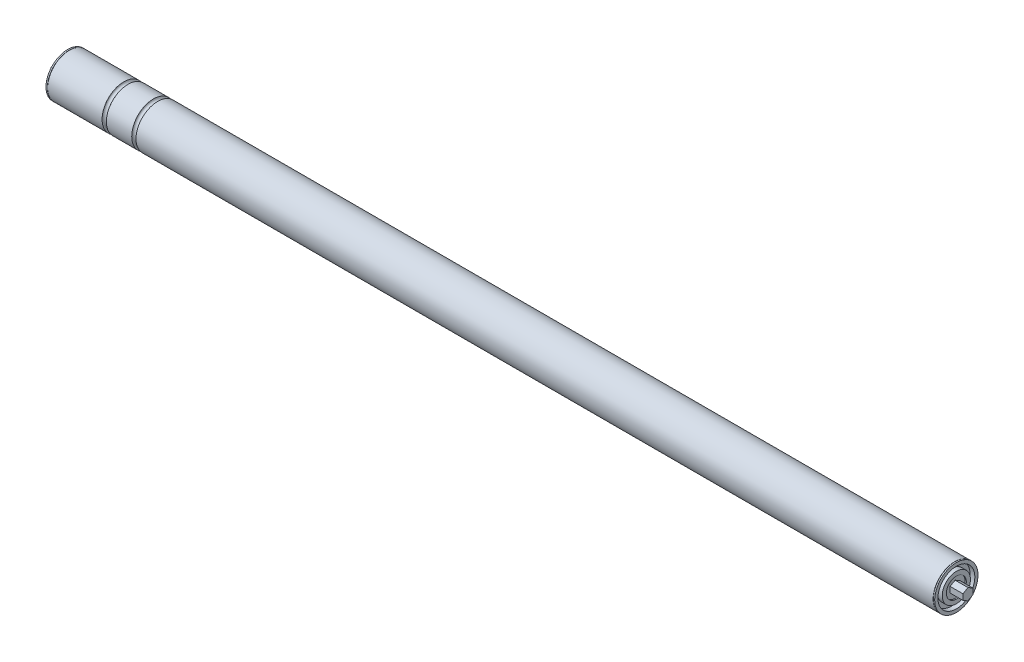
ISO-10303-21;
HEADER;
FILE_DESCRIPTION(('STEP AP214'),'2;1');
FILE_NAME('part.step','',(''),(''),'','','');
FILE_SCHEMA(('AUTOMOTIVE_DESIGN { 1 0 10303 214 1 1 1 1 }'));
ENDSEC;
DATA;
#1=APPLICATION_CONTEXT('core data for automotive mechanical design processes');
#2=APPLICATION_PROTOCOL_DEFINITION('international standard','automotive_design',2000,#1);
#3=PRODUCT_CONTEXT('',#1,'mechanical');
#4=PRODUCT('Part','Part','',(#3));
#5=PRODUCT_RELATED_PRODUCT_CATEGORY('part','',(#4));
#6=PRODUCT_DEFINITION_FORMATION('','',#4);
#7=PRODUCT_DEFINITION_CONTEXT('part definition',#1,'design');
#8=PRODUCT_DEFINITION('design','',#6,#7);
#9=PRODUCT_DEFINITION_SHAPE('','',#8);
#10=(LENGTH_UNIT() NAMED_UNIT(*) SI_UNIT(.MILLI.,.METRE.));
#11=(NAMED_UNIT(*) PLANE_ANGLE_UNIT() SI_UNIT($,.RADIAN.));
#12=(NAMED_UNIT(*) SI_UNIT($,.STERADIAN.) SOLID_ANGLE_UNIT());
#13=UNCERTAINTY_MEASURE_WITH_UNIT(LENGTH_MEASURE(1.E-05),#10,'distance_accuracy_value','');
#14=(GEOMETRIC_REPRESENTATION_CONTEXT(3) GLOBAL_UNCERTAINTY_ASSIGNED_CONTEXT((#13)) GLOBAL_UNIT_ASSIGNED_CONTEXT((#10,
#11,#12)) REPRESENTATION_CONTEXT('',''));
#15=CARTESIAN_POINT('',(0.,0.,0.));
#16=DIRECTION('',(0.,0.,1.));
#17=DIRECTION('',(1.,0.,0.));
#18=AXIS2_PLACEMENT_3D('',#15,#16,#17);
#19=CARTESIAN_POINT('',(556.234821520125,0.,0.));
#20=DIRECTION('',(-1.,0.,0.));
#21=DIRECTION('',(0.,0.,1.));
#22=AXIS2_PLACEMENT_3D('',#19,#20,#21);
#23=CYLINDRICAL_SURFACE('',#22,24.13);
#24=CARTESIAN_POINT('',(-427.830678291306,1.37139780605819E-13,0.));
#25=DIRECTION('',(1.,0.,0.));
#26=DIRECTION('',(0.,1.,0.));
#27=AXIS2_PLACEMENT_3D('',#24,#25,#26);
#28=CIRCLE('',#27,24.13);
#29=CARTESIAN_POINT('',(-427.830678291306,24.1300000000001,0.));
#30=VERTEX_POINT('',#29);
#31=EDGE_CURVE('E156',#30,#30,#28,.F.);
#32=ORIENTED_EDGE('',*,*,#31,.F.);
#33=EDGE_LOOP('',(#32));
#34=FACE_BOUND('',#33,.T.);
#35=CARTESIAN_POINT('',(-399.574321708694,1.26538187742656E-13,0.));
#36=DIRECTION('',(-1.,0.,0.));
#37=DIRECTION('',(0.,-1.,0.));
#38=AXIS2_PLACEMENT_3D('',#35,#36,#37);
#39=CIRCLE('',#38,24.13);
#40=CARTESIAN_POINT('',(-399.574321708693,-24.1299999999999,0.));
#41=VERTEX_POINT('',#40);
#42=EDGE_CURVE('E343',#41,#41,#39,.F.);
#43=ORIENTED_EDGE('',*,*,#42,.F.);
#44=EDGE_LOOP('',(#43));
#45=FACE_BOUND('',#44,.T.);
#46=ADVANCED_FACE('F39',(#34,#45),#23,.T.);
#47=CARTESIAN_POINT('',(-427.04385,1.38777878078145E-13,0.));
#48=DIRECTION('',(-1.,0.,0.));
#49=DIRECTION('',(0.,-1.,0.));
#50=AXIS2_PLACEMENT_3D('',#47,#48,#49);
#51=TOROIDAL_SURFACE('',#50,24.1000000000019,0.787399999999969);
#52=CARTESIAN_POINT('',(-427.83125,1.37158145291755E-13,0.));
#53=DIRECTION('',(-1.,0.,0.));
#54=DIRECTION('',(0.,-1.,0.));
#55=AXIS2_PLACEMENT_3D('',#52,#53,#54);
#56=CIRCLE('',#55,24.1000000000019);
#57=CARTESIAN_POINT('',(-427.83125,-24.1000000000017,0.));
#58=VERTEX_POINT('',#57);
#59=EDGE_CURVE('E163',#58,#58,#56,.T.);
#60=ORIENTED_EDGE('',*,*,#59,.F.);
#61=EDGE_LOOP('',(#60));
#62=FACE_BOUND('',#61,.T.);
#63=ORIENTED_EDGE('',*,*,#31,.T.);
#64=EDGE_LOOP('',(#63));
#65=FACE_BOUND('',#64,.T.);
#66=ADVANCED_FACE('F372',(#62,#65),#51,.T.);
#67=CARTESIAN_POINT('',(-433.38115,1.2490009027033E-13,0.));
#68=DIRECTION('',(-1.,0.,0.));
#69=DIRECTION('',(0.,-1.,0.));
#70=AXIS2_PLACEMENT_3D('',#67,#68,#69);
#71=TOROIDAL_SURFACE('',#70,24.1000000000019,0.787399999999969);
#72=CARTESIAN_POINT('',(-432.59375,1.27243098644159E-13,0.));
#73=DIRECTION('',(-1.,0.,0.));
#74=DIRECTION('',(0.,-1.,0.));
#75=AXIS2_PLACEMENT_3D('',#72,#73,#74);
#76=CIRCLE('',#75,24.1000000000019);
#77=CARTESIAN_POINT('',(-432.59375,-24.1000000000017,0.));
#78=VERTEX_POINT('',#77);
#79=EDGE_CURVE('E352',#78,#78,#76,.T.);
#80=ORIENTED_EDGE('',*,*,#79,.T.);
#81=EDGE_LOOP('',(#80));
#82=FACE_BOUND('',#81,.T.);
#83=CARTESIAN_POINT('',(-432.594321708693,1.26538187742656E-13,0.));
#84=DIRECTION('',(-1.,0.,0.));
#85=DIRECTION('',(0.,-1.,0.));
#86=AXIS2_PLACEMENT_3D('',#83,#84,#85);
#87=CIRCLE('',#86,24.13);
#88=CARTESIAN_POINT('',(-432.594321708693,-24.1299999999999,0.));
#89=VERTEX_POINT('',#88);
#90=EDGE_CURVE('E160',#89,#89,#87,.F.);
#91=ORIENTED_EDGE('',*,*,#90,.T.);
#92=EDGE_LOOP('',(#91));
#93=FACE_BOUND('',#92,.T.);
#94=ADVANCED_FACE('F375',(#82,#93),#71,.T.);
#95=CARTESIAN_POINT('',(-430.2125,1.31838984174237E-13,0.));
#96=DIRECTION('',(-1.,0.,0.));
#97=DIRECTION('',(0.,-1.,0.));
#98=AXIS2_PLACEMENT_3D('',#95,#96,#97);
#99=TOROIDAL_SURFACE('',#98,24.1000000000019,2.38124999999995);
#100=ORIENTED_EDGE('',*,*,#59,.T.);
#101=EDGE_LOOP('',(#100));
#102=FACE_BOUND('',#101,.T.);
#103=ORIENTED_EDGE('',*,*,#79,.F.);
#104=EDGE_LOOP('',(#103));
#105=FACE_BOUND('',#104,.T.);
#106=ADVANCED_FACE('F369',(#102,#105),#99,.F.);
#107=CARTESIAN_POINT('',(-508.,6.41580486636972,0.));
#108=DIRECTION('',(1.,0.,0.));
#109=DIRECTION('',(0.,0.,-1.));
#110=AXIS2_PLACEMENT_3D('',#107,#108,#109);
#111=PLANE('',#110);
#112=DIRECTION('',(0.,0.5,0.866025403784439));
#113=VECTOR('',#112,1.);
#114=CARTESIAN_POINT('',(-508.,3.20790243318486,-5.55625));
#115=LINE('',#114,#113);
#116=CARTESIAN_POINT('',(-508.,3.20790243318486,-5.55625));
#117=VERTEX_POINT('',#116);
#118=CARTESIAN_POINT('',(-508.,6.41580486636972,0.));
#119=VERTEX_POINT('',#118);
#120=EDGE_CURVE('E145',#117,#119,#115,.T.);
#121=ORIENTED_EDGE('',*,*,#120,.F.);
#122=DIRECTION('',(0.,1.,0.));
#123=VECTOR('',#122,1.);
#124=CARTESIAN_POINT('',(-508.,-3.20790243318486,-5.55625));
#125=LINE('',#124,#123);
#126=CARTESIAN_POINT('',(-508.,-3.20790243318486,-5.55625));
#127=VERTEX_POINT('',#126);
#128=EDGE_CURVE('E176',#127,#117,#125,.T.);
#129=ORIENTED_EDGE('',*,*,#128,.F.);
#130=DIRECTION('',(0.,0.5,-0.866025403784439));
#131=VECTOR('',#130,1.);
#132=CARTESIAN_POINT('',(-508.,-6.41580486636972,0.));
#133=LINE('',#132,#131);
#134=CARTESIAN_POINT('',(-508.,-6.41580486636972,0.));
#135=VERTEX_POINT('',#134);
#136=EDGE_CURVE('E172',#135,#127,#133,.T.);
#137=ORIENTED_EDGE('',*,*,#136,.F.);
#138=DIRECTION('',(0.,-0.5,-0.866025403784439));
#139=VECTOR('',#138,1.);
#140=CARTESIAN_POINT('',(-508.,-3.20790243318486,5.55625));
#141=LINE('',#140,#139);
#142=CARTESIAN_POINT('',(-508.,-3.20790243318486,5.55625));
#143=VERTEX_POINT('',#142);
#144=EDGE_CURVE('E168',#143,#135,#141,.T.);
#145=ORIENTED_EDGE('',*,*,#144,.F.);
#146=DIRECTION('',(0.,-1.,0.));
#147=VECTOR('',#146,1.);
#148=CARTESIAN_POINT('',(-508.,3.20790243318486,5.55625));
#149=LINE('',#148,#147);
#150=CARTESIAN_POINT('',(-508.,3.20790243318486,5.55625));
#151=VERTEX_POINT('',#150);
#152=EDGE_CURVE('E149',#151,#143,#149,.T.);
#153=ORIENTED_EDGE('',*,*,#152,.F.);
#154=DIRECTION('',(0.,-0.5,0.866025403784439));
#155=VECTOR('',#154,1.);
#156=CARTESIAN_POINT('',(-508.,6.41580486636972,0.));
#157=LINE('',#156,#155);
#158=EDGE_CURVE('E133',#119,#151,#157,.T.);
#159=ORIENTED_EDGE('',*,*,#158,.F.);
#160=EDGE_LOOP('',(#121,#129,#137,#145,#153,#159));
#161=FACE_BOUND('',#160,.T.);
#162=ADVANCED_FACE('F143',(#161),#111,.F.);
#163=CARTESIAN_POINT('',(508.,-3.20790243318486,-5.55625));
#164=DIRECTION('',(0.,0.,1.));
#165=DIRECTION('',(1.,0.,0.));
#166=AXIS2_PLACEMENT_3D('',#163,#164,#165);
#167=PLANE('',#166);
#168=DIRECTION('',(-1.,0.,0.));
#169=VECTOR('',#168,1.);
#170=CARTESIAN_POINT('',(508.,3.20790243318486,-5.55625));
#171=LINE('',#170,#169);
#172=CARTESIAN_POINT('',(-493.7125,3.20790243318486,-5.55625));
#173=VERTEX_POINT('',#172);
#174=EDGE_CURVE('E154',#173,#117,#171,.T.);
#175=ORIENTED_EDGE('',*,*,#174,.F.);
#176=DIRECTION('',(0.,-1.,0.));
#177=VECTOR('',#176,1.);
#178=CARTESIAN_POINT('',(-493.7125,0.,-5.55625));
#179=LINE('',#178,#177);
#180=CARTESIAN_POINT('',(-493.7125,-3.20790243318486,-5.55625));
#181=VERTEX_POINT('',#180);
#182=EDGE_CURVE('E223',#173,#181,#179,.T.);
#183=ORIENTED_EDGE('',*,*,#182,.T.);
#184=DIRECTION('',(-1.,0.,0.));
#185=VECTOR('',#184,1.);
#186=CARTESIAN_POINT('',(508.,-3.20790243318486,-5.55625));
#187=LINE('',#186,#185);
#188=EDGE_CURVE('E202',#181,#127,#187,.T.);
#189=ORIENTED_EDGE('',*,*,#188,.T.);
#190=ORIENTED_EDGE('',*,*,#128,.T.);
#191=EDGE_LOOP('',(#175,#183,#189,#190));
#192=FACE_BOUND('',#191,.T.);
#193=ADVANCED_FACE('F422',(#192),#167,.F.);
#194=CARTESIAN_POINT('',(508.,-6.41580486636972,0.));
#195=DIRECTION('',(0.,0.866025403784439,0.5));
#196=DIRECTION('',(0.,-0.5,0.866025403784439));
#197=AXIS2_PLACEMENT_3D('',#194,#195,#196);
#198=PLANE('',#197);
#199=ORIENTED_EDGE('',*,*,#188,.F.);
#200=DIRECTION('',(0.,-0.5,0.866025403784439));
#201=VECTOR('',#200,1.);
#202=CARTESIAN_POINT('',(-493.7125,-4.81185364977729,-2.778125));
#203=LINE('',#202,#201);
#204=CARTESIAN_POINT('',(-493.7125,-6.41580486636971,0.));
#205=VERTEX_POINT('',#204);
#206=EDGE_CURVE('E227',#181,#205,#203,.T.);
#207=ORIENTED_EDGE('',*,*,#206,.T.);
#208=DIRECTION('',(-1.,0.,0.));
#209=VECTOR('',#208,1.);
#210=CARTESIAN_POINT('',(508.,-6.41580486636972,0.));
#211=LINE('',#210,#209);
#212=EDGE_CURVE('E207',#205,#135,#211,.T.);
#213=ORIENTED_EDGE('',*,*,#212,.T.);
#214=ORIENTED_EDGE('',*,*,#136,.T.);
#215=EDGE_LOOP('',(#199,#207,#213,#214));
#216=FACE_BOUND('',#215,.T.);
#217=ADVANCED_FACE('F430',(#216),#198,.F.);
#218=CARTESIAN_POINT('',(508.,-3.20790243318486,5.55625));
#219=DIRECTION('',(0.,0.866025403784439,-0.5));
#220=DIRECTION('',(0.,0.5,0.866025403784439));
#221=AXIS2_PLACEMENT_3D('',#218,#219,#220);
#222=PLANE('',#221);
#223=ORIENTED_EDGE('',*,*,#212,.F.);
#224=DIRECTION('',(0.,0.5,0.866025403784439));
#225=VECTOR('',#224,1.);
#226=CARTESIAN_POINT('',(-493.7125,-4.81185364977729,2.778125));
#227=LINE('',#226,#225);
#228=CARTESIAN_POINT('',(-493.7125,-3.20790243318486,5.55625));
#229=VERTEX_POINT('',#228);
#230=EDGE_CURVE('E231',#205,#229,#227,.T.);
#231=ORIENTED_EDGE('',*,*,#230,.T.);
#232=DIRECTION('',(-1.,0.,0.));
#233=VECTOR('',#232,1.);
#234=CARTESIAN_POINT('',(508.,-3.20790243318486,5.55625));
#235=LINE('',#234,#233);
#236=EDGE_CURVE('E212',#229,#143,#235,.T.);
#237=ORIENTED_EDGE('',*,*,#236,.T.);
#238=ORIENTED_EDGE('',*,*,#144,.T.);
#239=EDGE_LOOP('',(#223,#231,#237,#238));
#240=FACE_BOUND('',#239,.T.);
#241=ADVANCED_FACE('F435',(#240),#222,.F.);
#242=CARTESIAN_POINT('',(508.,3.20790243318486,5.55625));
#243=DIRECTION('',(0.,0.,-1.));
#244=DIRECTION('',(-1.,0.,0.));
#245=AXIS2_PLACEMENT_3D('',#242,#243,#244);
#246=PLANE('',#245);
#247=ORIENTED_EDGE('',*,*,#236,.F.);
#248=DIRECTION('',(0.,1.,0.));
#249=VECTOR('',#248,1.);
#250=CARTESIAN_POINT('',(-493.7125,0.,5.55625));
#251=LINE('',#250,#249);
#252=CARTESIAN_POINT('',(-493.7125,3.20790243318486,5.55625));
#253=VERTEX_POINT('',#252);
#254=EDGE_CURVE('E235',#229,#253,#251,.T.);
#255=ORIENTED_EDGE('',*,*,#254,.T.);
#256=DIRECTION('',(-1.,0.,0.));
#257=VECTOR('',#256,1.);
#258=CARTESIAN_POINT('',(508.,3.20790243318486,5.55625));
#259=LINE('',#258,#257);
#260=EDGE_CURVE('E217',#253,#151,#259,.T.);
#261=ORIENTED_EDGE('',*,*,#260,.T.);
#262=ORIENTED_EDGE('',*,*,#152,.T.);
#263=EDGE_LOOP('',(#247,#255,#261,#262));
#264=FACE_BOUND('',#263,.T.);
#265=ADVANCED_FACE('F440',(#264),#246,.F.);
#266=CARTESIAN_POINT('',(508.,6.41580486636972,0.));
#267=DIRECTION('',(0.,-0.866025403784439,-0.5));
#268=DIRECTION('',(0.,0.5,-0.866025403784439));
#269=AXIS2_PLACEMENT_3D('',#266,#267,#268);
#270=PLANE('',#269);
#271=ORIENTED_EDGE('',*,*,#260,.F.);
#272=DIRECTION('',(0.,0.5,-0.866025403784439));
#273=VECTOR('',#272,1.);
#274=CARTESIAN_POINT('',(-493.7125,4.81185364977729,2.778125));
#275=LINE('',#274,#273);
#276=CARTESIAN_POINT('',(-493.7125,6.41580486636972,0.));
#277=VERTEX_POINT('',#276);
#278=EDGE_CURVE('E61',#253,#277,#275,.T.);
#279=ORIENTED_EDGE('',*,*,#278,.T.);
#280=DIRECTION('',(-1.,0.,0.));
#281=VECTOR('',#280,1.);
#282=CARTESIAN_POINT('',(508.,6.41580486636972,0.));
#283=LINE('',#282,#281);
#284=EDGE_CURVE('E129',#277,#119,#283,.T.);
#285=ORIENTED_EDGE('',*,*,#284,.T.);
#286=ORIENTED_EDGE('',*,*,#158,.T.);
#287=EDGE_LOOP('',(#271,#279,#285,#286));
#288=FACE_BOUND('',#287,.T.);
#289=ADVANCED_FACE('F132',(#288),#270,.F.);
#290=CARTESIAN_POINT('',(508.,3.20790243318486,-5.55625));
#291=DIRECTION('',(0.,-0.866025403784439,0.5));
#292=DIRECTION('',(0.,-0.5,-0.866025403784439));
#293=AXIS2_PLACEMENT_3D('',#290,#291,#292);
#294=PLANE('',#293);
#295=ORIENTED_EDGE('',*,*,#284,.F.);
#296=DIRECTION('',(0.,-0.5,-0.866025403784439));
#297=VECTOR('',#296,1.);
#298=CARTESIAN_POINT('',(-493.7125,4.81185364977729,-2.778125));
#299=LINE('',#298,#297);
#300=EDGE_CURVE('E57',#277,#173,#299,.T.);
#301=ORIENTED_EDGE('',*,*,#300,.T.);
#302=ORIENTED_EDGE('',*,*,#174,.T.);
#303=ORIENTED_EDGE('',*,*,#120,.T.);
#304=EDGE_LOOP('',(#295,#301,#302,#303));
#305=FACE_BOUND('',#304,.T.);
#306=ADVANCED_FACE('F152',(#305),#294,.F.);
#307=CARTESIAN_POINT('',(-493.7125,0.,0.));
#308=DIRECTION('',(1.,0.,0.));
#309=DIRECTION('',(0.,1.,0.));
#310=AXIS2_PLACEMENT_3D('',#307,#308,#309);
#311=PLANE('',#310);
#312=CARTESIAN_POINT('',(-493.7125,0.,0.));
#313=DIRECTION('',(-1.,0.,0.));
#314=DIRECTION('',(0.,-1.,0.));
#315=AXIS2_PLACEMENT_3D('',#312,#313,#314);
#316=CIRCLE('',#315,11.1125);
#317=CARTESIAN_POINT('',(-493.7125,-11.1125,0.));
#318=VERTEX_POINT('',#317);
#319=EDGE_CURVE('E302',#318,#318,#316,.T.);
#320=ORIENTED_EDGE('',*,*,#319,.T.);
#321=EDGE_LOOP('',(#320));
#322=FACE_BOUND('',#321,.T.);
#323=ORIENTED_EDGE('',*,*,#300,.F.);
#324=ORIENTED_EDGE('',*,*,#278,.F.);
#325=ORIENTED_EDGE('',*,*,#254,.F.);
#326=ORIENTED_EDGE('',*,*,#230,.F.);
#327=ORIENTED_EDGE('',*,*,#206,.F.);
#328=ORIENTED_EDGE('',*,*,#182,.F.);
#329=EDGE_LOOP('',(#323,#324,#325,#326,#327,#328));
#330=FACE_BOUND('',#329,.T.);
#331=ADVANCED_FACE('F450',(#322,#330),#311,.F.);
#332=CARTESIAN_POINT('',(-493.7125,0.,0.));
#333=DIRECTION('',(-1.,0.,0.));
#334=DIRECTION('',(0.,-1.,0.));
#335=AXIS2_PLACEMENT_3D('',#332,#333,#334);
#336=CYLINDRICAL_SURFACE('',#335,11.1125);
#337=ORIENTED_EDGE('',*,*,#319,.F.);
#338=EDGE_LOOP('',(#337));
#339=FACE_BOUND('',#338,.T.);
#340=CARTESIAN_POINT('',(-495.096875,0.,0.));
#341=DIRECTION('',(-1.,0.,0.));
#342=DIRECTION('',(0.,-1.,0.));
#343=AXIS2_PLACEMENT_3D('',#340,#341,#342);
#344=CIRCLE('',#343,11.1125);
#345=CARTESIAN_POINT('',(-495.096875,-11.1125,0.));
#346=VERTEX_POINT('',#345);
#347=EDGE_CURVE('E298',#346,#346,#344,.T.);
#348=ORIENTED_EDGE('',*,*,#347,.T.);
#349=EDGE_LOOP('',(#348));
#350=FACE_BOUND('',#349,.T.);
#351=ADVANCED_FACE('F646',(#339,#350),#336,.F.);
#352=CARTESIAN_POINT('',(-495.096875,-11.1125,0.));
#353=DIRECTION('',(1.,0.,0.));
#354=DIRECTION('',(0.,1.,0.));
#355=AXIS2_PLACEMENT_3D('',#352,#353,#354);
#356=PLANE('',#355);
#357=ORIENTED_EDGE('',*,*,#347,.F.);
#358=EDGE_LOOP('',(#357));
#359=FACE_BOUND('',#358,.T.);
#360=CARTESIAN_POINT('',(-495.096875,0.,0.));
#361=DIRECTION('',(-1.,0.,0.));
#362=DIRECTION('',(0.,-1.,0.));
#363=AXIS2_PLACEMENT_3D('',#360,#361,#362);
#364=CIRCLE('',#363,15.7129275651736);
#365=CARTESIAN_POINT('',(-495.096875,-15.7129275651736,0.));
#366=VERTEX_POINT('',#365);
#367=EDGE_CURVE('E294',#366,#366,#364,.T.);
#368=ORIENTED_EDGE('',*,*,#367,.T.);
#369=EDGE_LOOP('',(#368));
#370=FACE_BOUND('',#369,.T.);
#371=ADVANCED_FACE('F766',(#359,#370),#356,.F.);
#372=CARTESIAN_POINT('',(-493.7125,0.,0.));
#373=DIRECTION('',(-1.,0.,0.));
#374=DIRECTION('',(0.,-1.,0.));
#375=AXIS2_PLACEMENT_3D('',#372,#373,#374);
#376=CYLINDRICAL_SURFACE('',#375,15.7129275651736);
#377=ORIENTED_EDGE('',*,*,#367,.F.);
#378=EDGE_LOOP('',(#377));
#379=FACE_BOUND('',#378,.T.);
#380=CARTESIAN_POINT('',(-489.762875,0.,0.));
#381=DIRECTION('',(-1.,0.,0.));
#382=DIRECTION('',(0.,-1.,0.));
#383=AXIS2_PLACEMENT_3D('',#380,#381,#382);
#384=CIRCLE('',#383,15.7129275651736);
#385=CARTESIAN_POINT('',(-489.762875,-15.7129275651736,0.));
#386=VERTEX_POINT('',#385);
#387=EDGE_CURVE('E290',#386,#386,#384,.T.);
#388=ORIENTED_EDGE('',*,*,#387,.T.);
#389=EDGE_LOOP('',(#388));
#390=FACE_BOUND('',#389,.T.);
#391=ADVANCED_FACE('F756',(#379,#390),#376,.T.);
#392=CARTESIAN_POINT('',(-489.762875,-15.7129275651736,1.09722786744795E-13));
#393=DIRECTION('',(1.,0.,0.));
#394=DIRECTION('',(0.,1.,0.));
#395=AXIS2_PLACEMENT_3D('',#392,#393,#394);
#396=PLANE('',#395);
#397=ORIENTED_EDGE('',*,*,#387,.F.);
#398=EDGE_LOOP('',(#397));
#399=FACE_BOUND('',#398,.T.);
#400=CARTESIAN_POINT('',(-489.762875,0.,0.));
#401=DIRECTION('',(-1.,0.,0.));
#402=DIRECTION('',(0.,-1.,0.));
#403=AXIS2_PLACEMENT_3D('',#400,#401,#402);
#404=CIRCLE('',#403,20.574);
#405=CARTESIAN_POINT('',(-489.762875,-20.574,0.));
#406=VERTEX_POINT('',#405);
#407=EDGE_CURVE('E286',#406,#406,#404,.T.);
#408=ORIENTED_EDGE('',*,*,#407,.T.);
#409=EDGE_LOOP('',(#408));
#410=FACE_BOUND('',#409,.T.);
#411=ADVANCED_FACE('F746',(#399,#410),#396,.F.);
#412=CARTESIAN_POINT('',(-493.7125,0.,0.));
#413=DIRECTION('',(-1.,0.,0.));
#414=DIRECTION('',(0.,-1.,0.));
#415=AXIS2_PLACEMENT_3D('',#412,#413,#414);
#416=CYLINDRICAL_SURFACE('',#415,20.574);
#417=ORIENTED_EDGE('',*,*,#407,.F.);
#418=EDGE_LOOP('',(#417));
#419=FACE_BOUND('',#418,.T.);
#420=CARTESIAN_POINT('',(-495.096875,0.,0.));
#421=DIRECTION('',(-1.,0.,0.));
#422=DIRECTION('',(0.,-1.,0.));
#423=AXIS2_PLACEMENT_3D('',#420,#421,#422);
#424=CIRCLE('',#423,20.574);
#425=CARTESIAN_POINT('',(-495.096875,-20.574,0.));
#426=VERTEX_POINT('',#425);
#427=EDGE_CURVE('E282',#426,#426,#424,.T.);
#428=ORIENTED_EDGE('',*,*,#427,.T.);
#429=EDGE_LOOP('',(#428));
#430=FACE_BOUND('',#429,.T.);
#431=ADVANCED_FACE('F736',(#419,#430),#416,.F.);
#432=CARTESIAN_POINT('',(-495.096875,-24.13,1.6849888941257E-13));
#433=DIRECTION('',(1.,0.,0.));
#434=DIRECTION('',(0.,1.,0.));
#435=AXIS2_PLACEMENT_3D('',#432,#433,#434);
#436=PLANE('',#435);
#437=ORIENTED_EDGE('',*,*,#427,.F.);
#438=EDGE_LOOP('',(#437));
#439=FACE_BOUND('',#438,.T.);
#440=CARTESIAN_POINT('',(-495.096875,0.,0.));
#441=DIRECTION('',(-1.,0.,0.));
#442=DIRECTION('',(0.,-1.,0.));
#443=AXIS2_PLACEMENT_3D('',#440,#441,#442);
#444=CIRCLE('',#443,24.13);
#445=CARTESIAN_POINT('',(-495.096875,-24.13,0.));
#446=VERTEX_POINT('',#445);
#447=EDGE_CURVE('E278',#446,#446,#444,.T.);
#448=ORIENTED_EDGE('',*,*,#447,.T.);
#449=EDGE_LOOP('',(#448));
#450=FACE_BOUND('',#449,.T.);
#451=ADVANCED_FACE('F692',(#439,#450),#436,.F.);
#452=CARTESIAN_POINT('',(-493.7125,0.,0.));
#453=DIRECTION('',(-1.,0.,0.));
#454=DIRECTION('',(0.,-1.,0.));
#455=AXIS2_PLACEMENT_3D('',#452,#453,#454);
#456=CYLINDRICAL_SURFACE('',#455,24.13);
#457=CARTESIAN_POINT('',(-493.572875,0.,0.));
#458=DIRECTION('',(-1.,0.,0.));
#459=DIRECTION('',(0.,-1.,0.));
#460=AXIS2_PLACEMENT_3D('',#457,#458,#459);
#461=CIRCLE('',#460,24.13);
#462=CARTESIAN_POINT('',(-493.572875,-24.13,0.));
#463=VERTEX_POINT('',#462);
#464=EDGE_CURVE('E306',#463,#463,#461,.T.);
#465=ORIENTED_EDGE('',*,*,#464,.T.);
#466=EDGE_LOOP('',(#465));
#467=FACE_BOUND('',#466,.T.);
#468=ORIENTED_EDGE('',*,*,#447,.F.);
#469=EDGE_LOOP('',(#468));
#470=FACE_BOUND('',#469,.T.);
#471=ADVANCED_FACE('F676',(#467,#470),#456,.T.);
#472=CARTESIAN_POINT('',(-493.572875,0.,0.));
#473=DIRECTION('',(-1.,0.,0.));
#474=DIRECTION('',(0.,-1.,0.));
#475=AXIS2_PLACEMENT_3D('',#472,#473,#474);
#476=CONICAL_SURFACE('',#475,24.13,0.785398163397469);
#477=CARTESIAN_POINT('',(-493.318875,0.,0.));
#478=DIRECTION('',(-1.,0.,0.));
#479=DIRECTION('',(0.,-1.,0.));
#480=AXIS2_PLACEMENT_3D('',#477,#478,#479);
#481=CIRCLE('',#480,23.876);
#482=CARTESIAN_POINT('',(-493.318875,-23.876,0.));
#483=VERTEX_POINT('',#482);
#484=EDGE_CURVE('E310',#483,#483,#481,.F.);
#485=ORIENTED_EDGE('',*,*,#484,.F.);
#486=EDGE_LOOP('',(#485));
#487=FACE_BOUND('',#486,.T.);
#488=ORIENTED_EDGE('',*,*,#464,.F.);
#489=EDGE_LOOP('',(#488));
#490=FACE_BOUND('',#489,.T.);
#491=ADVANCED_FACE('F455',(#487,#490),#476,.T.);
#492=CARTESIAN_POINT('',(-493.318875,-24.13,1.6849888941257E-13));
#493=DIRECTION('',(-1.,0.,0.));
#494=DIRECTION('',(0.,-1.,0.));
#495=AXIS2_PLACEMENT_3D('',#492,#493,#494);
#496=PLANE('',#495);
#497=ORIENTED_EDGE('',*,*,#484,.T.);
#498=EDGE_LOOP('',(#497));
#499=FACE_BOUND('',#498,.T.);
#500=CARTESIAN_POINT('',(-493.318875,0.,0.));
#501=DIRECTION('',(-1.,0.,0.));
#502=DIRECTION('',(0.,-1.,0.));
#503=AXIS2_PLACEMENT_3D('',#500,#501,#502);
#504=CIRCLE('',#503,24.13);
#505=CARTESIAN_POINT('',(-493.318875,-24.13,0.));
#506=VERTEX_POINT('',#505);
#507=EDGE_CURVE('E246',#506,#506,#504,.T.);
#508=ORIENTED_EDGE('',*,*,#507,.T.);
#509=EDGE_LOOP('',(#508));
#510=FACE_BOUND('',#509,.T.);
#511=ADVANCED_FACE('F390',(#499,#510),#496,.T.);
#512=ORIENTED_EDGE('',*,*,#507,.F.);
#513=EDGE_LOOP('',(#512));
#514=FACE_BOUND('',#513,.T.);
#515=ORIENTED_EDGE('',*,*,#90,.F.);
#516=EDGE_LOOP('',(#515));
#517=FACE_BOUND('',#516,.T.);
#518=ADVANCED_FACE('F382',(#514,#517),#23,.T.);
#519=CARTESIAN_POINT('',(-394.02385,1.38777878078145E-13,0.));
#520=DIRECTION('',(-1.,0.,0.));
#521=DIRECTION('',(0.,-1.,0.));
#522=AXIS2_PLACEMENT_3D('',#519,#520,#521);
#523=TOROIDAL_SURFACE('',#522,24.1000000000019,0.787399999999969);
#524=CARTESIAN_POINT('',(-394.81125,1.37158145291755E-13,0.));
#525=DIRECTION('',(-1.,0.,0.));
#526=DIRECTION('',(0.,-1.,0.));
#527=AXIS2_PLACEMENT_3D('',#524,#525,#526);
#528=CIRCLE('',#527,24.1000000000019);
#529=CARTESIAN_POINT('',(-394.81125,-24.1000000000017,0.));
#530=VERTEX_POINT('',#529);
#531=EDGE_CURVE('E346',#530,#530,#528,.T.);
#532=ORIENTED_EDGE('',*,*,#531,.F.);
#533=EDGE_LOOP('',(#532));
#534=FACE_BOUND('',#533,.T.);
#535=CARTESIAN_POINT('',(-394.810678291306,1.37139780605819E-13,0.));
#536=DIRECTION('',(1.,0.,0.));
#537=DIRECTION('',(0.,1.,0.));
#538=AXIS2_PLACEMENT_3D('',#535,#536,#537);
#539=CIRCLE('',#538,24.13);
#540=CARTESIAN_POINT('',(-394.810678291306,24.1300000000001,0.));
#541=VERTEX_POINT('',#540);
#542=EDGE_CURVE('E43',#541,#541,#539,.F.);
#543=ORIENTED_EDGE('',*,*,#542,.T.);
#544=EDGE_LOOP('',(#543));
#545=FACE_BOUND('',#544,.T.);
#546=ADVANCED_FACE('F389',(#534,#545),#523,.T.);
#547=CARTESIAN_POINT('',(-400.36115,1.2490009027033E-13,0.));
#548=DIRECTION('',(-1.,0.,0.));
#549=DIRECTION('',(0.,-1.,0.));
#550=AXIS2_PLACEMENT_3D('',#547,#548,#549);
#551=TOROIDAL_SURFACE('',#550,24.1000000000019,0.787399999999969);
#552=CARTESIAN_POINT('',(-399.57375,1.27243098644159E-13,0.));
#553=DIRECTION('',(-1.,0.,0.));
#554=DIRECTION('',(0.,-1.,0.));
#555=AXIS2_PLACEMENT_3D('',#552,#553,#554);
#556=CIRCLE('',#555,24.1000000000019);
#557=CARTESIAN_POINT('',(-399.57375,-24.1000000000017,0.));
#558=VERTEX_POINT('',#557);
#559=EDGE_CURVE('E354',#558,#558,#556,.T.);
#560=ORIENTED_EDGE('',*,*,#559,.T.);
#561=EDGE_LOOP('',(#560));
#562=FACE_BOUND('',#561,.T.);
#563=ORIENTED_EDGE('',*,*,#42,.T.);
#564=EDGE_LOOP('',(#563));
#565=FACE_BOUND('',#564,.T.);
#566=ADVANCED_FACE('F405',(#562,#565),#551,.T.);
#567=CARTESIAN_POINT('',(-397.1925,1.31838984174237E-13,0.));
#568=DIRECTION('',(-1.,0.,0.));
#569=DIRECTION('',(0.,-1.,0.));
#570=AXIS2_PLACEMENT_3D('',#567,#568,#569);
#571=TOROIDAL_SURFACE('',#570,24.1000000000019,2.38124999999995);
#572=ORIENTED_EDGE('',*,*,#531,.T.);
#573=EDGE_LOOP('',(#572));
#574=FACE_BOUND('',#573,.T.);
#575=ORIENTED_EDGE('',*,*,#559,.F.);
#576=EDGE_LOOP('',(#575));
#577=FACE_BOUND('',#576,.T.);
#578=ADVANCED_FACE('F411',(#574,#577),#571,.F.);
#579=CARTESIAN_POINT('',(508.,6.41580486636972,0.));
#580=DIRECTION('',(1.,0.,0.));
#581=DIRECTION('',(0.,0.,-1.));
#582=AXIS2_PLACEMENT_3D('',#579,#580,#581);
#583=PLANE('',#582);
#584=DIRECTION('',(0.,0.5,0.866025403784439));
#585=VECTOR('',#584,1.);
#586=CARTESIAN_POINT('',(508.,3.20790243318486,-5.55625));
#587=LINE('',#586,#585);
#588=CARTESIAN_POINT('',(508.,3.20790243318486,-5.55625));
#589=VERTEX_POINT('',#588);
#590=CARTESIAN_POINT('',(508.,6.41580486636972,0.));
#591=VERTEX_POINT('',#590);
#592=EDGE_CURVE('E179',#589,#591,#587,.T.);
#593=ORIENTED_EDGE('',*,*,#592,.T.);
#594=DIRECTION('',(0.,-0.5,0.866025403784439));
#595=VECTOR('',#594,1.);
#596=CARTESIAN_POINT('',(508.,6.41580486636972,0.));
#597=LINE('',#596,#595);
#598=CARTESIAN_POINT('',(508.,3.20790243318486,5.55625));
#599=VERTEX_POINT('',#598);
#600=EDGE_CURVE('E183',#591,#599,#597,.T.);
#601=ORIENTED_EDGE('',*,*,#600,.T.);
#602=DIRECTION('',(0.,-1.,0.));
#603=VECTOR('',#602,1.);
#604=CARTESIAN_POINT('',(508.,3.20790243318486,5.55625));
#605=LINE('',#604,#603);
#606=CARTESIAN_POINT('',(508.,-3.20790243318486,5.55625));
#607=VERTEX_POINT('',#606);
#608=EDGE_CURVE('E186',#599,#607,#605,.T.);
#609=ORIENTED_EDGE('',*,*,#608,.T.);
#610=DIRECTION('',(0.,-0.5,-0.866025403784439));
#611=VECTOR('',#610,1.);
#612=CARTESIAN_POINT('',(508.,-3.20790243318486,5.55625));
#613=LINE('',#612,#611);
#614=CARTESIAN_POINT('',(508.,-6.41580486636972,0.));
#615=VERTEX_POINT('',#614);
#616=EDGE_CURVE('E189',#607,#615,#613,.T.);
#617=ORIENTED_EDGE('',*,*,#616,.T.);
#618=DIRECTION('',(0.,0.5,-0.866025403784439));
#619=VECTOR('',#618,1.);
#620=CARTESIAN_POINT('',(508.,-6.41580486636972,0.));
#621=LINE('',#620,#619);
#622=CARTESIAN_POINT('',(508.,-3.20790243318486,-5.55625));
#623=VERTEX_POINT('',#622);
#624=EDGE_CURVE('E192',#615,#623,#621,.T.);
#625=ORIENTED_EDGE('',*,*,#624,.T.);
#626=DIRECTION('',(0.,1.,0.));
#627=VECTOR('',#626,1.);
#628=CARTESIAN_POINT('',(508.,-3.20790243318486,-5.55625));
#629=LINE('',#628,#627);
#630=EDGE_CURVE('E195',#623,#589,#629,.T.);
#631=ORIENTED_EDGE('',*,*,#630,.T.);
#632=EDGE_LOOP('',(#593,#601,#609,#617,#625,#631));
#633=FACE_BOUND('',#632,.T.);
#634=ADVANCED_FACE('F423',(#633),#583,.T.);
#635=CARTESIAN_POINT('',(493.7125,6.41580486636972,0.));
#636=VERTEX_POINT('',#635);
#637=EDGE_CURVE('E137',#591,#636,#283,.T.);
#638=ORIENTED_EDGE('',*,*,#637,.T.);
#639=DIRECTION('',(0.,-0.5,0.866025403784439));
#640=VECTOR('',#639,1.);
#641=CARTESIAN_POINT('',(493.7125,4.81185364977729,2.778125));
#642=LINE('',#641,#640);
#643=CARTESIAN_POINT('',(493.7125,3.20790243318486,5.55625));
#644=VERTEX_POINT('',#643);
#645=EDGE_CURVE('E49',#636,#644,#642,.T.);
#646=ORIENTED_EDGE('',*,*,#645,.T.);
#647=EDGE_CURVE('E138',#599,#644,#259,.T.);
#648=ORIENTED_EDGE('',*,*,#647,.F.);
#649=ORIENTED_EDGE('',*,*,#600,.F.);
#650=EDGE_LOOP('',(#638,#646,#648,#649));
#651=FACE_BOUND('',#650,.T.);
#652=ADVANCED_FACE('F426',(#651),#270,.F.);
#653=ORIENTED_EDGE('',*,*,#647,.T.);
#654=DIRECTION('',(0.,-1.,0.));
#655=VECTOR('',#654,1.);
#656=CARTESIAN_POINT('',(493.7125,0.,5.55625));
#657=LINE('',#656,#655);
#658=CARTESIAN_POINT('',(493.7125,-3.20790243318486,5.55625));
#659=VERTEX_POINT('',#658);
#660=EDGE_CURVE('E334',#644,#659,#657,.T.);
#661=ORIENTED_EDGE('',*,*,#660,.T.);
#662=EDGE_CURVE('E213',#607,#659,#235,.T.);
#663=ORIENTED_EDGE('',*,*,#662,.F.);
#664=ORIENTED_EDGE('',*,*,#608,.F.);
#665=EDGE_LOOP('',(#653,#661,#663,#664));
#666=FACE_BOUND('',#665,.T.);
#667=ADVANCED_FACE('F446',(#666),#246,.F.);
#668=ORIENTED_EDGE('',*,*,#662,.T.);
#669=DIRECTION('',(0.,-0.5,-0.866025403784439));
#670=VECTOR('',#669,1.);
#671=CARTESIAN_POINT('',(493.7125,-4.81185364977729,2.778125));
#672=LINE('',#671,#670);
#673=CARTESIAN_POINT('',(493.7125,-6.41580486636971,0.));
#674=VERTEX_POINT('',#673);
#675=EDGE_CURVE('E330',#659,#674,#672,.T.);
#676=ORIENTED_EDGE('',*,*,#675,.T.);
#677=EDGE_CURVE('E208',#615,#674,#211,.T.);
#678=ORIENTED_EDGE('',*,*,#677,.F.);
#679=ORIENTED_EDGE('',*,*,#616,.F.);
#680=EDGE_LOOP('',(#668,#676,#678,#679));
#681=FACE_BOUND('',#680,.T.);
#682=ADVANCED_FACE('F442',(#681),#222,.F.);
#683=ORIENTED_EDGE('',*,*,#677,.T.);
#684=DIRECTION('',(0.,0.5,-0.866025403784439));
#685=VECTOR('',#684,1.);
#686=CARTESIAN_POINT('',(493.7125,-4.81185364977729,-2.778125));
#687=LINE('',#686,#685);
#688=CARTESIAN_POINT('',(493.7125,-3.20790243318486,-5.55625));
#689=VERTEX_POINT('',#688);
#690=EDGE_CURVE('E326',#674,#689,#687,.T.);
#691=ORIENTED_EDGE('',*,*,#690,.T.);
#692=EDGE_CURVE('E203',#623,#689,#187,.T.);
#693=ORIENTED_EDGE('',*,*,#692,.F.);
#694=ORIENTED_EDGE('',*,*,#624,.F.);
#695=EDGE_LOOP('',(#683,#691,#693,#694));
#696=FACE_BOUND('',#695,.T.);
#697=ADVANCED_FACE('F437',(#696),#198,.F.);
#698=ORIENTED_EDGE('',*,*,#692,.T.);
#699=DIRECTION('',(0.,1.,0.));
#700=VECTOR('',#699,1.);
#701=CARTESIAN_POINT('',(493.7125,0.,-5.55625));
#702=LINE('',#701,#700);
#703=CARTESIAN_POINT('',(493.7125,3.20790243318486,-5.55625));
#704=VERTEX_POINT('',#703);
#705=EDGE_CURVE('E322',#689,#704,#702,.T.);
#706=ORIENTED_EDGE('',*,*,#705,.T.);
#707=EDGE_CURVE('E198',#589,#704,#171,.T.);
#708=ORIENTED_EDGE('',*,*,#707,.F.);
#709=ORIENTED_EDGE('',*,*,#630,.F.);
#710=EDGE_LOOP('',(#698,#706,#708,#709));
#711=FACE_BOUND('',#710,.T.);
#712=ADVANCED_FACE('F432',(#711),#167,.F.);
#713=ORIENTED_EDGE('',*,*,#707,.T.);
#714=DIRECTION('',(0.,0.5,0.866025403784439));
#715=VECTOR('',#714,1.);
#716=CARTESIAN_POINT('',(493.7125,4.81185364977729,-2.778125));
#717=LINE('',#716,#715);
#718=EDGE_CURVE('E11',#704,#636,#717,.T.);
#719=ORIENTED_EDGE('',*,*,#718,.T.);
#720=ORIENTED_EDGE('',*,*,#637,.F.);
#721=ORIENTED_EDGE('',*,*,#592,.F.);
#722=EDGE_LOOP('',(#713,#719,#720,#721));
#723=FACE_BOUND('',#722,.T.);
#724=ADVANCED_FACE('F451',(#723),#294,.F.);
#725=CARTESIAN_POINT('',(493.7125,0.,0.));
#726=DIRECTION('',(-1.,0.,0.));
#727=DIRECTION('',(0.,1.,0.));
#728=AXIS2_PLACEMENT_3D('',#725,#726,#727);
#729=PLANE('',#728);
#730=CARTESIAN_POINT('',(493.7125,0.,0.));
#731=DIRECTION('',(-1.,0.,0.));
#732=DIRECTION('',(0.,-1.,0.));
#733=AXIS2_PLACEMENT_3D('',#730,#731,#732);
#734=CIRCLE('',#733,11.1125);
#735=CARTESIAN_POINT('',(493.7125,-11.1125,0.));
#736=VERTEX_POINT('',#735);
#737=EDGE_CURVE('E274',#736,#736,#734,.T.);
#738=ORIENTED_EDGE('',*,*,#737,.F.);
#739=EDGE_LOOP('',(#738));
#740=FACE_BOUND('',#739,.T.);
#741=ORIENTED_EDGE('',*,*,#718,.F.);
#742=ORIENTED_EDGE('',*,*,#705,.F.);
#743=ORIENTED_EDGE('',*,*,#690,.F.);
#744=ORIENTED_EDGE('',*,*,#675,.F.);
#745=ORIENTED_EDGE('',*,*,#660,.F.);
#746=ORIENTED_EDGE('',*,*,#645,.F.);
#747=EDGE_LOOP('',(#741,#742,#743,#744,#745,#746));
#748=FACE_BOUND('',#747,.T.);
#749=ADVANCED_FACE('F483',(#740,#748),#729,.F.);
#750=CARTESIAN_POINT('',(493.7125,0.,0.));
#751=DIRECTION('',(1.,0.,0.));
#752=DIRECTION('',(0.,-1.,0.));
#753=AXIS2_PLACEMENT_3D('',#750,#751,#752);
#754=CYLINDRICAL_SURFACE('',#753,11.1125);
#755=ORIENTED_EDGE('',*,*,#737,.T.);
#756=EDGE_LOOP('',(#755));
#757=FACE_BOUND('',#756,.T.);
#758=CARTESIAN_POINT('',(495.096875,0.,0.));
#759=DIRECTION('',(-1.,0.,0.));
#760=DIRECTION('',(0.,-1.,0.));
#761=AXIS2_PLACEMENT_3D('',#758,#759,#760);
#762=CIRCLE('',#761,11.1125);
#763=CARTESIAN_POINT('',(495.096875,-11.1125,0.));
#764=VERTEX_POINT('',#763);
#765=EDGE_CURVE('E270',#764,#764,#762,.T.);
#766=ORIENTED_EDGE('',*,*,#765,.F.);
#767=EDGE_LOOP('',(#766));
#768=FACE_BOUND('',#767,.T.);
#769=ADVANCED_FACE('F480',(#757,#768),#754,.F.);
#770=CARTESIAN_POINT('',(495.096875,-11.1125,0.));
#771=DIRECTION('',(-1.,0.,0.));
#772=DIRECTION('',(0.,1.,0.));
#773=AXIS2_PLACEMENT_3D('',#770,#771,#772);
#774=PLANE('',#773);
#775=ORIENTED_EDGE('',*,*,#765,.T.);
#776=EDGE_LOOP('',(#775));
#777=FACE_BOUND('',#776,.T.);
#778=CARTESIAN_POINT('',(495.096875,0.,0.));
#779=DIRECTION('',(-1.,0.,0.));
#780=DIRECTION('',(0.,-1.,0.));
#781=AXIS2_PLACEMENT_3D('',#778,#779,#780);
#782=CIRCLE('',#781,15.7129275651736);
#783=CARTESIAN_POINT('',(495.096875,-15.7129275651736,0.));
#784=VERTEX_POINT('',#783);
#785=EDGE_CURVE('E266',#784,#784,#782,.T.);
#786=ORIENTED_EDGE('',*,*,#785,.F.);
#787=EDGE_LOOP('',(#786));
#788=FACE_BOUND('',#787,.T.);
#789=ADVANCED_FACE('F476',(#777,#788),#774,.F.);
#790=CARTESIAN_POINT('',(493.7125,0.,0.));
#791=DIRECTION('',(1.,0.,0.));
#792=DIRECTION('',(0.,-1.,0.));
#793=AXIS2_PLACEMENT_3D('',#790,#791,#792);
#794=CYLINDRICAL_SURFACE('',#793,15.7129275651736);
#795=ORIENTED_EDGE('',*,*,#785,.T.);
#796=EDGE_LOOP('',(#795));
#797=FACE_BOUND('',#796,.T.);
#798=CARTESIAN_POINT('',(489.762875,0.,0.));
#799=DIRECTION('',(-1.,0.,0.));
#800=DIRECTION('',(0.,-1.,0.));
#801=AXIS2_PLACEMENT_3D('',#798,#799,#800);
#802=CIRCLE('',#801,15.7129275651736);
#803=CARTESIAN_POINT('',(489.762875,-15.7129275651736,0.));
#804=VERTEX_POINT('',#803);
#805=EDGE_CURVE('E262',#804,#804,#802,.T.);
#806=ORIENTED_EDGE('',*,*,#805,.F.);
#807=EDGE_LOOP('',(#806));
#808=FACE_BOUND('',#807,.T.);
#809=ADVANCED_FACE('F472',(#797,#808),#794,.T.);
#810=CARTESIAN_POINT('',(489.762875,-15.7129275651736,1.09722786744795E-13));
#811=DIRECTION('',(-1.,0.,0.));
#812=DIRECTION('',(0.,1.,0.));
#813=AXIS2_PLACEMENT_3D('',#810,#811,#812);
#814=PLANE('',#813);
#815=ORIENTED_EDGE('',*,*,#805,.T.);
#816=EDGE_LOOP('',(#815));
#817=FACE_BOUND('',#816,.T.);
#818=CARTESIAN_POINT('',(489.762875,0.,0.));
#819=DIRECTION('',(-1.,0.,0.));
#820=DIRECTION('',(0.,-1.,0.));
#821=AXIS2_PLACEMENT_3D('',#818,#819,#820);
#822=CIRCLE('',#821,20.574);
#823=CARTESIAN_POINT('',(489.762875,-20.574,0.));
#824=VERTEX_POINT('',#823);
#825=EDGE_CURVE('E258',#824,#824,#822,.T.);
#826=ORIENTED_EDGE('',*,*,#825,.F.);
#827=EDGE_LOOP('',(#826));
#828=FACE_BOUND('',#827,.T.);
#829=ADVANCED_FACE('F468',(#817,#828),#814,.F.);
#830=CARTESIAN_POINT('',(493.7125,0.,0.));
#831=DIRECTION('',(1.,0.,0.));
#832=DIRECTION('',(0.,-1.,0.));
#833=AXIS2_PLACEMENT_3D('',#830,#831,#832);
#834=CYLINDRICAL_SURFACE('',#833,20.574);
#835=ORIENTED_EDGE('',*,*,#825,.T.);
#836=EDGE_LOOP('',(#835));
#837=FACE_BOUND('',#836,.T.);
#838=CARTESIAN_POINT('',(495.096875,0.,0.));
#839=DIRECTION('',(-1.,0.,0.));
#840=DIRECTION('',(0.,-1.,0.));
#841=AXIS2_PLACEMENT_3D('',#838,#839,#840);
#842=CIRCLE('',#841,20.574);
#843=CARTESIAN_POINT('',(495.096875,-20.574,0.));
#844=VERTEX_POINT('',#843);
#845=EDGE_CURVE('E254',#844,#844,#842,.T.);
#846=ORIENTED_EDGE('',*,*,#845,.F.);
#847=EDGE_LOOP('',(#846));
#848=FACE_BOUND('',#847,.T.);
#849=ADVANCED_FACE('F464',(#837,#848),#834,.F.);
#850=CARTESIAN_POINT('',(495.096875,-24.13,1.6849888941257E-13));
#851=DIRECTION('',(-1.,0.,0.));
#852=DIRECTION('',(0.,1.,0.));
#853=AXIS2_PLACEMENT_3D('',#850,#851,#852);
#854=PLANE('',#853);
#855=ORIENTED_EDGE('',*,*,#845,.T.);
#856=EDGE_LOOP('',(#855));
#857=FACE_BOUND('',#856,.T.);
#858=CARTESIAN_POINT('',(495.096875,0.,0.));
#859=DIRECTION('',(-1.,0.,0.));
#860=DIRECTION('',(0.,-1.,0.));
#861=AXIS2_PLACEMENT_3D('',#858,#859,#860);
#862=CIRCLE('',#861,24.13);
#863=CARTESIAN_POINT('',(495.096875,-24.13,0.));
#864=VERTEX_POINT('',#863);
#865=EDGE_CURVE('E250',#864,#864,#862,.T.);
#866=ORIENTED_EDGE('',*,*,#865,.F.);
#867=EDGE_LOOP('',(#866));
#868=FACE_BOUND('',#867,.T.);
#869=ADVANCED_FACE('F460',(#857,#868),#854,.F.);
#870=CARTESIAN_POINT('',(493.7125,0.,0.));
#871=DIRECTION('',(1.,0.,0.));
#872=DIRECTION('',(0.,-1.,0.));
#873=AXIS2_PLACEMENT_3D('',#870,#871,#872);
#874=CYLINDRICAL_SURFACE('',#873,24.13);
#875=CARTESIAN_POINT('',(493.572875,0.,0.));
#876=DIRECTION('',(1.,0.,0.));
#877=DIRECTION('',(0.,1.,0.));
#878=AXIS2_PLACEMENT_3D('',#875,#876,#877);
#879=CIRCLE('',#878,24.13);
#880=CARTESIAN_POINT('',(493.572875,24.13,0.));
#881=VERTEX_POINT('',#880);
#882=EDGE_CURVE('E318',#881,#881,#879,.T.);
#883=ORIENTED_EDGE('',*,*,#882,.T.);
#884=EDGE_LOOP('',(#883));
#885=FACE_BOUND('',#884,.T.);
#886=ORIENTED_EDGE('',*,*,#865,.T.);
#887=EDGE_LOOP('',(#886));
#888=FACE_BOUND('',#887,.T.);
#889=ADVANCED_FACE('F457',(#885,#888),#874,.T.);
#890=CARTESIAN_POINT('',(493.318875,0.,0.));
#891=DIRECTION('',(1.,0.,0.));
#892=DIRECTION('',(0.,1.,0.));
#893=AXIS2_PLACEMENT_3D('',#890,#891,#892);
#894=CONICAL_SURFACE('',#893,23.876,0.785398163397585);
#895=ORIENTED_EDGE('',*,*,#882,.F.);
#896=EDGE_LOOP('',(#895));
#897=FACE_BOUND('',#896,.T.);
#898=CARTESIAN_POINT('',(493.318875,0.,0.));
#899=DIRECTION('',(1.,0.,0.));
#900=DIRECTION('',(0.,1.,0.));
#901=AXIS2_PLACEMENT_3D('',#898,#899,#900);
#902=CIRCLE('',#901,23.876);
#903=CARTESIAN_POINT('',(493.318875,23.876,0.));
#904=VERTEX_POINT('',#903);
#905=EDGE_CURVE('E314',#904,#904,#902,.F.);
#906=ORIENTED_EDGE('',*,*,#905,.F.);
#907=EDGE_LOOP('',(#906));
#908=FACE_BOUND('',#907,.T.);
#909=ADVANCED_FACE('F41',(#897,#908),#894,.T.);
#910=CARTESIAN_POINT('',(493.318875,-24.13,1.6849888941257E-13));
#911=DIRECTION('',(1.,0.,0.));
#912=DIRECTION('',(0.,-1.,0.));
#913=AXIS2_PLACEMENT_3D('',#910,#911,#912);
#914=PLANE('',#913);
#915=ORIENTED_EDGE('',*,*,#905,.T.);
#916=EDGE_LOOP('',(#915));
#917=FACE_BOUND('',#916,.T.);
#918=CARTESIAN_POINT('',(493.318875,0.,0.));
#919=DIRECTION('',(1.,0.,0.));
#920=DIRECTION('',(0.,1.,0.));
#921=AXIS2_PLACEMENT_3D('',#918,#919,#920);
#922=CIRCLE('',#921,24.13);
#923=CARTESIAN_POINT('',(493.318875,24.13,0.));
#924=VERTEX_POINT('',#923);
#925=EDGE_CURVE('E242',#924,#924,#922,.F.);
#926=ORIENTED_EDGE('',*,*,#925,.F.);
#927=EDGE_LOOP('',(#926));
#928=FACE_BOUND('',#927,.T.);
#929=ADVANCED_FACE('F393',(#917,#928),#914,.T.);
#930=ORIENTED_EDGE('',*,*,#925,.T.);
#931=EDGE_LOOP('',(#930));
#932=FACE_BOUND('',#931,.T.);
#933=ORIENTED_EDGE('',*,*,#542,.F.);
#934=EDGE_LOOP('',(#933));
#935=FACE_BOUND('',#934,.T.);
#936=ADVANCED_FACE('F383',(#932,#935),#23,.T.);
#937=CLOSED_SHELL('',(#46,#66,#94,#106,#162,#193,#217,#241,#265,#289,#306,#331,#351,#371,#391,
#411,#431,#451,#471,#491,#511,#518,#546,#566,#578,#634,#652,#667,#682,#697,#712,#724,#749,#769,
#789,#809,#829,#849,#869,#889,#909,#929,#936));
#938=MANIFOLD_SOLID_BREP('B2',#937);
#939=ADVANCED_BREP_SHAPE_REPRESENTATION('',(#18,#938),#14);
#940=SHAPE_DEFINITION_REPRESENTATION(#9,#939);
ENDSEC;
END-ISO-10303-21;
